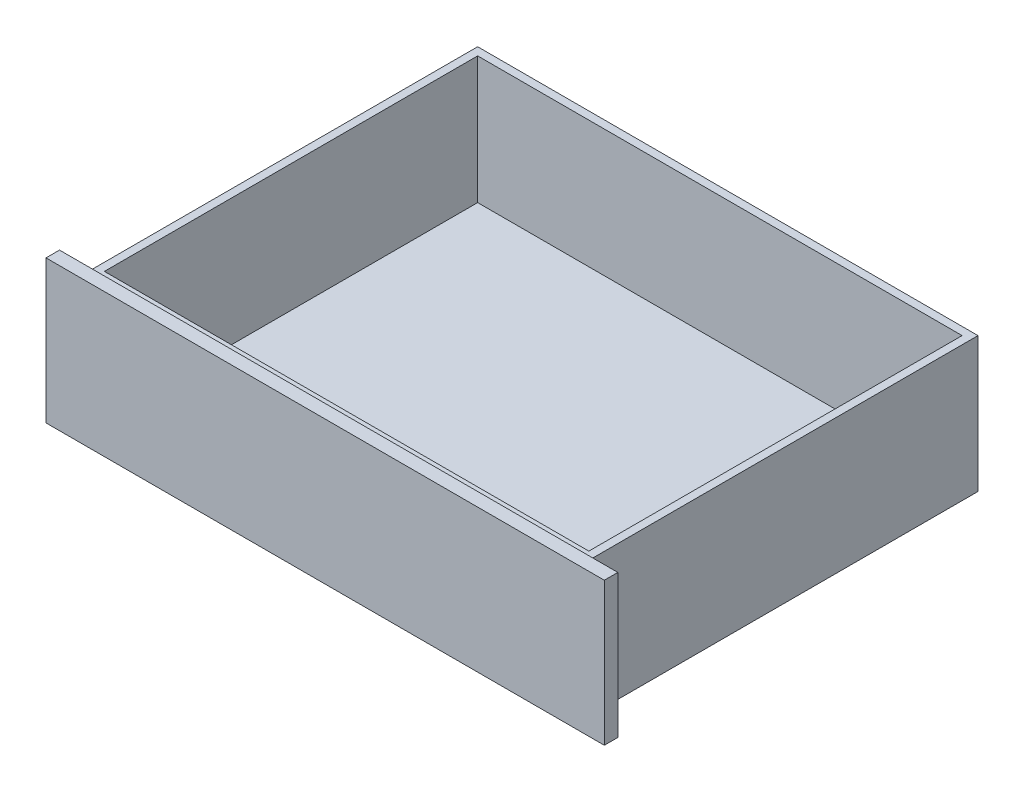
ISO-10303-21;
HEADER;
FILE_DESCRIPTION(('STEP AP214'),'2;1');
FILE_NAME('part.step','',(''),(''),'','','');
FILE_SCHEMA(('AUTOMOTIVE_DESIGN { 1 0 10303 214 1 1 1 1 }'));
ENDSEC;
DATA;
#1=APPLICATION_CONTEXT('core data for automotive mechanical design processes');
#2=APPLICATION_PROTOCOL_DEFINITION('international standard','automotive_design',2000,#1);
#3=PRODUCT_CONTEXT('',#1,'mechanical');
#4=PRODUCT('Part','Part','',(#3));
#5=PRODUCT_RELATED_PRODUCT_CATEGORY('part','',(#4));
#6=PRODUCT_DEFINITION_FORMATION('','',#4);
#7=PRODUCT_DEFINITION_CONTEXT('part definition',#1,'design');
#8=PRODUCT_DEFINITION('design','',#6,#7);
#9=PRODUCT_DEFINITION_SHAPE('','',#8);
#10=(LENGTH_UNIT() NAMED_UNIT(*) SI_UNIT(.MILLI.,.METRE.));
#11=(NAMED_UNIT(*) PLANE_ANGLE_UNIT() SI_UNIT($,.RADIAN.));
#12=(NAMED_UNIT(*) SI_UNIT($,.STERADIAN.) SOLID_ANGLE_UNIT());
#13=UNCERTAINTY_MEASURE_WITH_UNIT(LENGTH_MEASURE(1.E-05),#10,'distance_accuracy_value','');
#14=(GEOMETRIC_REPRESENTATION_CONTEXT(3) GLOBAL_UNCERTAINTY_ASSIGNED_CONTEXT((#13)) GLOBAL_UNIT_ASSIGNED_CONTEXT((#10,
#11,#12)) REPRESENTATION_CONTEXT('',''));
#15=CARTESIAN_POINT('',(0.,0.,0.));
#16=DIRECTION('',(0.,0.,1.));
#17=DIRECTION('',(1.,0.,0.));
#18=AXIS2_PLACEMENT_3D('',#15,#16,#17);
#19=CARTESIAN_POINT('',(0.,170.,0.));
#20=DIRECTION('',(0.,-1.,0.));
#21=DIRECTION('',(0.,0.,-1.));
#22=AXIS2_PLACEMENT_3D('',#19,#20,#21);
#23=PLANE('',#22);
#24=DIRECTION('',(0.,0.,-1.));
#25=VECTOR('',#24,1.);
#26=CARTESIAN_POINT('',(315.,170.,245.));
#27=LINE('',#26,#25);
#28=CARTESIAN_POINT('',(315.,170.,245.));
#29=VERTEX_POINT('',#28);
#30=CARTESIAN_POINT('',(315.,170.,-245.));
#31=VERTEX_POINT('',#30);
#32=EDGE_CURVE('E191',#29,#31,#27,.T.);
#33=ORIENTED_EDGE('',*,*,#32,.T.);
#34=DIRECTION('',(-1.,0.,0.));
#35=VECTOR('',#34,1.);
#36=CARTESIAN_POINT('',(-315.,170.,-245.));
#37=LINE('',#36,#35);
#38=CARTESIAN_POINT('',(-315.,170.,-245.));
#39=VERTEX_POINT('',#38);
#40=EDGE_CURVE('E83',#31,#39,#37,.T.);
#41=ORIENTED_EDGE('',*,*,#40,.T.);
#42=DIRECTION('',(0.,0.,1.));
#43=VECTOR('',#42,1.);
#44=CARTESIAN_POINT('',(-315.,170.,245.));
#45=LINE('',#44,#43);
#46=CARTESIAN_POINT('',(-315.,170.,245.));
#47=VERTEX_POINT('',#46);
#48=EDGE_CURVE('E195',#39,#47,#45,.T.);
#49=ORIENTED_EDGE('',*,*,#48,.T.);
#50=DIRECTION('',(1.,0.,0.));
#51=VECTOR('',#50,1.);
#52=CARTESIAN_POINT('',(-315.,170.,245.));
#53=LINE('',#52,#51);
#54=EDGE_CURVE('E58',#47,#29,#53,.T.);
#55=ORIENTED_EDGE('',*,*,#54,.T.);
#56=EDGE_LOOP('',(#33,#41,#49,#55));
#57=FACE_BOUND('',#56,.T.);
#58=DIRECTION('',(0.,0.,-1.));
#59=VECTOR('',#58,1.);
#60=CARTESIAN_POINT('',(305.,170.,0.));
#61=LINE('',#60,#59);
#62=CARTESIAN_POINT('',(305.,170.,235.));
#63=VERTEX_POINT('',#62);
#64=CARTESIAN_POINT('',(305.,170.,-235.));
#65=VERTEX_POINT('',#64);
#66=EDGE_CURVE('E184',#63,#65,#61,.T.);
#67=ORIENTED_EDGE('',*,*,#66,.F.);
#68=DIRECTION('',(1.,0.,0.));
#69=VECTOR('',#68,1.);
#70=CARTESIAN_POINT('',(0.,170.,235.));
#71=LINE('',#70,#69);
#72=CARTESIAN_POINT('',(-305.,170.,235.));
#73=VERTEX_POINT('',#72);
#74=EDGE_CURVE('E175',#73,#63,#71,.T.);
#75=ORIENTED_EDGE('',*,*,#74,.F.);
#76=DIRECTION('',(0.,0.,1.));
#77=VECTOR('',#76,1.);
#78=CARTESIAN_POINT('',(-305.,170.,0.));
#79=LINE('',#78,#77);
#80=CARTESIAN_POINT('',(-305.,170.,-235.));
#81=VERTEX_POINT('',#80);
#82=EDGE_CURVE('E188',#81,#73,#79,.T.);
#83=ORIENTED_EDGE('',*,*,#82,.F.);
#84=DIRECTION('',(-1.,0.,0.));
#85=VECTOR('',#84,1.);
#86=CARTESIAN_POINT('',(0.,170.,-235.));
#87=LINE('',#86,#85);
#88=EDGE_CURVE('E186',#65,#81,#87,.T.);
#89=ORIENTED_EDGE('',*,*,#88,.F.);
#90=EDGE_LOOP('',(#67,#75,#83,#89));
#91=FACE_BOUND('',#90,.T.);
#92=ADVANCED_FACE('F34',(#57,#91),#23,.F.);
#93=CARTESIAN_POINT('',(315.,170.,245.));
#94=DIRECTION('',(-1.,0.,0.));
#95=DIRECTION('',(0.,0.,1.));
#96=AXIS2_PLACEMENT_3D('',#93,#94,#95);
#97=PLANE('',#96);
#98=DIRECTION('',(0.,0.,-1.));
#99=VECTOR('',#98,1.);
#100=CARTESIAN_POINT('',(315.,0.,245.));
#101=LINE('',#100,#99);
#102=CARTESIAN_POINT('',(315.,0.,245.));
#103=VERTEX_POINT('',#102);
#104=CARTESIAN_POINT('',(315.,0.,-245.));
#105=VERTEX_POINT('',#104);
#106=EDGE_CURVE('E170',#103,#105,#101,.T.);
#107=ORIENTED_EDGE('',*,*,#106,.T.);
#108=DIRECTION('',(0.,-1.,0.));
#109=VECTOR('',#108,1.);
#110=CARTESIAN_POINT('',(315.,170.,-245.));
#111=LINE('',#110,#109);
#112=EDGE_CURVE('E11',#31,#105,#111,.T.);
#113=ORIENTED_EDGE('',*,*,#112,.F.);
#114=ORIENTED_EDGE('',*,*,#32,.F.);
#115=DIRECTION('',(0.,-1.,0.));
#116=VECTOR('',#115,1.);
#117=CARTESIAN_POINT('',(315.,170.,245.));
#118=LINE('',#117,#116);
#119=EDGE_CURVE('E76',#29,#103,#118,.T.);
#120=ORIENTED_EDGE('',*,*,#119,.T.);
#121=EDGE_LOOP('',(#107,#113,#114,#120));
#122=FACE_BOUND('',#121,.T.);
#123=ADVANCED_FACE('F36',(#122),#97,.F.);
#124=CARTESIAN_POINT('',(-315.,170.,-245.));
#125=DIRECTION('',(0.,0.,1.));
#126=DIRECTION('',(1.,0.,0.));
#127=AXIS2_PLACEMENT_3D('',#124,#125,#126);
#128=PLANE('',#127);
#129=DIRECTION('',(-1.,0.,0.));
#130=VECTOR('',#129,1.);
#131=CARTESIAN_POINT('',(-315.,0.,-245.));
#132=LINE('',#131,#130);
#133=CARTESIAN_POINT('',(-315.,0.,-245.));
#134=VERTEX_POINT('',#133);
#135=EDGE_CURVE('E199',#105,#134,#132,.T.);
#136=ORIENTED_EDGE('',*,*,#135,.T.);
#137=DIRECTION('',(0.,-1.,0.));
#138=VECTOR('',#137,1.);
#139=CARTESIAN_POINT('',(-315.,170.,-245.));
#140=LINE('',#139,#138);
#141=EDGE_CURVE('E42',#39,#134,#140,.T.);
#142=ORIENTED_EDGE('',*,*,#141,.F.);
#143=ORIENTED_EDGE('',*,*,#40,.F.);
#144=ORIENTED_EDGE('',*,*,#112,.T.);
#145=EDGE_LOOP('',(#136,#142,#143,#144));
#146=FACE_BOUND('',#145,.T.);
#147=ADVANCED_FACE('F238',(#146),#128,.F.);
#148=CARTESIAN_POINT('',(-315.,170.,245.));
#149=DIRECTION('',(1.,0.,0.));
#150=DIRECTION('',(0.,0.,-1.));
#151=AXIS2_PLACEMENT_3D('',#148,#149,#150);
#152=PLANE('',#151);
#153=DIRECTION('',(0.,0.,1.));
#154=VECTOR('',#153,1.);
#155=CARTESIAN_POINT('',(-315.,0.,245.));
#156=LINE('',#155,#154);
#157=CARTESIAN_POINT('',(-315.,0.,245.));
#158=VERTEX_POINT('',#157);
#159=EDGE_CURVE('E201',#134,#158,#156,.T.);
#160=ORIENTED_EDGE('',*,*,#159,.T.);
#161=DIRECTION('',(0.,-1.,0.));
#162=VECTOR('',#161,1.);
#163=CARTESIAN_POINT('',(-315.,170.,245.));
#164=LINE('',#163,#162);
#165=EDGE_CURVE('E207',#47,#158,#164,.T.);
#166=ORIENTED_EDGE('',*,*,#165,.F.);
#167=ORIENTED_EDGE('',*,*,#48,.F.);
#168=ORIENTED_EDGE('',*,*,#141,.T.);
#169=EDGE_LOOP('',(#160,#166,#167,#168));
#170=FACE_BOUND('',#169,.T.);
#171=ADVANCED_FACE('F213',(#170),#152,.F.);
#172=CARTESIAN_POINT('',(0.,0.,0.));
#173=DIRECTION('',(0.,-1.,0.));
#174=DIRECTION('',(0.,0.,-1.));
#175=AXIS2_PLACEMENT_3D('',#172,#173,#174);
#176=PLANE('',#175);
#177=ORIENTED_EDGE('',*,*,#106,.F.);
#178=DIRECTION('',(1.,0.,0.));
#179=VECTOR('',#178,1.);
#180=CARTESIAN_POINT('',(-315.,0.,245.));
#181=LINE('',#180,#179);
#182=EDGE_CURVE('E193',#158,#103,#181,.T.);
#183=ORIENTED_EDGE('',*,*,#182,.F.);
#184=ORIENTED_EDGE('',*,*,#159,.F.);
#185=ORIENTED_EDGE('',*,*,#135,.F.);
#186=EDGE_LOOP('',(#177,#183,#184,#185));
#187=FACE_BOUND('',#186,.T.);
#188=ADVANCED_FACE('F216',(#187),#176,.T.);
#189=CARTESIAN_POINT('',(305.,170.,245.));
#190=DIRECTION('',(-1.,0.,0.));
#191=DIRECTION('',(0.,0.,1.));
#192=AXIS2_PLACEMENT_3D('',#189,#190,#191);
#193=PLANE('',#192);
#194=DIRECTION('',(0.,0.,-1.));
#195=VECTOR('',#194,1.);
#196=CARTESIAN_POINT('',(305.,10.,0.));
#197=LINE('',#196,#195);
#198=CARTESIAN_POINT('',(305.,10.,235.));
#199=VERTEX_POINT('',#198);
#200=CARTESIAN_POINT('',(305.,10.,-235.));
#201=VERTEX_POINT('',#200);
#202=EDGE_CURVE('E158',#199,#201,#197,.T.);
#203=ORIENTED_EDGE('',*,*,#202,.F.);
#204=DIRECTION('',(0.,-1.,0.));
#205=VECTOR('',#204,1.);
#206=CARTESIAN_POINT('',(305.,170.,235.));
#207=LINE('',#206,#205);
#208=EDGE_CURVE('E172',#63,#199,#207,.T.);
#209=ORIENTED_EDGE('',*,*,#208,.F.);
#210=ORIENTED_EDGE('',*,*,#66,.T.);
#211=DIRECTION('',(0.,-1.,0.));
#212=VECTOR('',#211,1.);
#213=CARTESIAN_POINT('',(305.,170.,-235.));
#214=LINE('',#213,#212);
#215=EDGE_CURVE('E167',#65,#201,#214,.T.);
#216=ORIENTED_EDGE('',*,*,#215,.T.);
#217=EDGE_LOOP('',(#203,#209,#210,#216));
#218=FACE_BOUND('',#217,.T.);
#219=ADVANCED_FACE('F244',(#218),#193,.T.);
#220=CARTESIAN_POINT('',(-315.,170.,-235.));
#221=DIRECTION('',(0.,0.,1.));
#222=DIRECTION('',(1.,0.,0.));
#223=AXIS2_PLACEMENT_3D('',#220,#221,#222);
#224=PLANE('',#223);
#225=DIRECTION('',(-1.,0.,0.));
#226=VECTOR('',#225,1.);
#227=CARTESIAN_POINT('',(0.,10.,-235.));
#228=LINE('',#227,#226);
#229=CARTESIAN_POINT('',(-305.,10.,-235.));
#230=VERTEX_POINT('',#229);
#231=EDGE_CURVE('E161',#201,#230,#228,.T.);
#232=ORIENTED_EDGE('',*,*,#231,.F.);
#233=ORIENTED_EDGE('',*,*,#215,.F.);
#234=ORIENTED_EDGE('',*,*,#88,.T.);
#235=DIRECTION('',(0.,-1.,0.));
#236=VECTOR('',#235,1.);
#237=CARTESIAN_POINT('',(-305.,170.,-235.));
#238=LINE('',#237,#236);
#239=EDGE_CURVE('E171',#81,#230,#238,.T.);
#240=ORIENTED_EDGE('',*,*,#239,.T.);
#241=EDGE_LOOP('',(#232,#233,#234,#240));
#242=FACE_BOUND('',#241,.T.);
#243=ADVANCED_FACE('F266',(#242),#224,.T.);
#244=CARTESIAN_POINT('',(-305.,170.,245.));
#245=DIRECTION('',(1.,0.,0.));
#246=DIRECTION('',(0.,0.,-1.));
#247=AXIS2_PLACEMENT_3D('',#244,#245,#246);
#248=PLANE('',#247);
#249=DIRECTION('',(0.,0.,1.));
#250=VECTOR('',#249,1.);
#251=CARTESIAN_POINT('',(-305.,10.,0.));
#252=LINE('',#251,#250);
#253=CARTESIAN_POINT('',(-305.,10.,235.));
#254=VERTEX_POINT('',#253);
#255=EDGE_CURVE('E177',#230,#254,#252,.T.);
#256=ORIENTED_EDGE('',*,*,#255,.F.);
#257=ORIENTED_EDGE('',*,*,#239,.F.);
#258=ORIENTED_EDGE('',*,*,#82,.T.);
#259=DIRECTION('',(0.,-1.,0.));
#260=VECTOR('',#259,1.);
#261=CARTESIAN_POINT('',(-305.,170.,235.));
#262=LINE('',#261,#260);
#263=EDGE_CURVE('E49',#73,#254,#262,.T.);
#264=ORIENTED_EDGE('',*,*,#263,.T.);
#265=EDGE_LOOP('',(#256,#257,#258,#264));
#266=FACE_BOUND('',#265,.T.);
#267=ADVANCED_FACE('F274',(#266),#248,.T.);
#268=CARTESIAN_POINT('',(-315.,170.,235.));
#269=DIRECTION('',(0.,0.,-1.));
#270=DIRECTION('',(-1.,0.,0.));
#271=AXIS2_PLACEMENT_3D('',#268,#269,#270);
#272=PLANE('',#271);
#273=DIRECTION('',(1.,0.,0.));
#274=VECTOR('',#273,1.);
#275=CARTESIAN_POINT('',(0.,10.,235.));
#276=LINE('',#275,#274);
#277=EDGE_CURVE('E181',#254,#199,#276,.T.);
#278=ORIENTED_EDGE('',*,*,#277,.F.);
#279=ORIENTED_EDGE('',*,*,#263,.F.);
#280=ORIENTED_EDGE('',*,*,#74,.T.);
#281=ORIENTED_EDGE('',*,*,#208,.T.);
#282=EDGE_LOOP('',(#278,#279,#280,#281));
#283=FACE_BOUND('',#282,.T.);
#284=ADVANCED_FACE('F228',(#283),#272,.T.);
#285=CARTESIAN_POINT('',(0.,10.,0.));
#286=DIRECTION('',(0.,-1.,0.));
#287=DIRECTION('',(0.,0.,-1.));
#288=AXIS2_PLACEMENT_3D('',#285,#286,#287);
#289=PLANE('',#288);
#290=ORIENTED_EDGE('',*,*,#202,.T.);
#291=ORIENTED_EDGE('',*,*,#231,.T.);
#292=ORIENTED_EDGE('',*,*,#255,.T.);
#293=ORIENTED_EDGE('',*,*,#277,.T.);
#294=EDGE_LOOP('',(#290,#291,#292,#293));
#295=FACE_BOUND('',#294,.T.);
#296=ADVANCED_FACE('F220',(#295),#289,.F.);
#297=CARTESIAN_POINT('',(0.,0.,245.));
#298=DIRECTION('',(0.,0.,1.));
#299=DIRECTION('',(1.,0.,0.));
#300=AXIS2_PLACEMENT_3D('',#297,#298,#299);
#301=PLANE('',#300);
#302=DIRECTION('',(1.,0.,0.));
#303=VECTOR('',#302,1.);
#304=CARTESIAN_POINT('',(-351.5,-4.99999999999999,245.));
#305=LINE('',#304,#303);
#306=CARTESIAN_POINT('',(-351.5,-4.99999999999999,245.));
#307=VERTEX_POINT('',#306);
#308=CARTESIAN_POINT('',(351.5,-4.99999999999999,245.));
#309=VERTEX_POINT('',#308);
#310=EDGE_CURVE('E157',#307,#309,#305,.T.);
#311=ORIENTED_EDGE('',*,*,#310,.F.);
#312=DIRECTION('',(0.,1.,0.));
#313=VECTOR('',#312,1.);
#314=CARTESIAN_POINT('',(-351.5,-4.99999999999999,245.));
#315=LINE('',#314,#313);
#316=CARTESIAN_POINT('',(-351.5,175.,245.));
#317=VERTEX_POINT('',#316);
#318=EDGE_CURVE('E153',#307,#317,#315,.T.);
#319=ORIENTED_EDGE('',*,*,#318,.T.);
#320=DIRECTION('',(1.,0.,0.));
#321=VECTOR('',#320,1.);
#322=CARTESIAN_POINT('',(-351.5,175.,245.));
#323=LINE('',#322,#321);
#324=CARTESIAN_POINT('',(351.5,175.,245.));
#325=VERTEX_POINT('',#324);
#326=EDGE_CURVE('E367',#317,#325,#323,.T.);
#327=ORIENTED_EDGE('',*,*,#326,.T.);
#328=DIRECTION('',(0.,1.,0.));
#329=VECTOR('',#328,1.);
#330=CARTESIAN_POINT('',(351.5,-4.99999999999999,245.));
#331=LINE('',#330,#329);
#332=EDGE_CURVE('E369',#309,#325,#331,.T.);
#333=ORIENTED_EDGE('',*,*,#332,.F.);
#334=EDGE_LOOP('',(#311,#319,#327,#333));
#335=FACE_BOUND('',#334,.T.);
#336=ORIENTED_EDGE('',*,*,#165,.T.);
#337=ORIENTED_EDGE('',*,*,#182,.T.);
#338=ORIENTED_EDGE('',*,*,#119,.F.);
#339=ORIENTED_EDGE('',*,*,#54,.F.);
#340=EDGE_LOOP('',(#336,#337,#338,#339));
#341=FACE_BOUND('',#340,.T.);
#342=ADVANCED_FACE('F218',(#335,#341),#301,.F.);
#343=CARTESIAN_POINT('',(-351.5,-4.99999999999999,262.));
#344=DIRECTION('',(0.,1.,0.));
#345=DIRECTION('',(0.,0.,1.));
#346=AXIS2_PLACEMENT_3D('',#343,#344,#345);
#347=PLANE('',#346);
#348=ORIENTED_EDGE('',*,*,#310,.T.);
#349=DIRECTION('',(0.,0.,-1.));
#350=VECTOR('',#349,1.);
#351=CARTESIAN_POINT('',(351.5,-4.99999999999999,262.));
#352=LINE('',#351,#350);
#353=CARTESIAN_POINT('',(351.5,-4.99999999999999,262.));
#354=VERTEX_POINT('',#353);
#355=EDGE_CURVE('E138',#354,#309,#352,.T.);
#356=ORIENTED_EDGE('',*,*,#355,.F.);
#357=DIRECTION('',(1.,0.,0.));
#358=VECTOR('',#357,1.);
#359=CARTESIAN_POINT('',(-351.5,-4.99999999999999,262.));
#360=LINE('',#359,#358);
#361=CARTESIAN_POINT('',(-351.5,-4.99999999999999,262.));
#362=VERTEX_POINT('',#361);
#363=EDGE_CURVE('E145',#362,#354,#360,.T.);
#364=ORIENTED_EDGE('',*,*,#363,.F.);
#365=DIRECTION('',(0.,0.,-1.));
#366=VECTOR('',#365,1.);
#367=CARTESIAN_POINT('',(-351.5,-4.99999999999999,262.));
#368=LINE('',#367,#366);
#369=EDGE_CURVE('E364',#362,#307,#368,.T.);
#370=ORIENTED_EDGE('',*,*,#369,.T.);
#371=EDGE_LOOP('',(#348,#356,#364,#370));
#372=FACE_BOUND('',#371,.T.);
#373=ADVANCED_FACE('F155',(#372),#347,.F.);
#374=CARTESIAN_POINT('',(351.5,-4.99999999999999,262.));
#375=DIRECTION('',(-1.,0.,0.));
#376=DIRECTION('',(0.,0.,1.));
#377=AXIS2_PLACEMENT_3D('',#374,#375,#376);
#378=PLANE('',#377);
#379=ORIENTED_EDGE('',*,*,#332,.T.);
#380=DIRECTION('',(0.,0.,-1.));
#381=VECTOR('',#380,1.);
#382=CARTESIAN_POINT('',(351.5,175.,262.));
#383=LINE('',#382,#381);
#384=CARTESIAN_POINT('',(351.5,175.,262.));
#385=VERTEX_POINT('',#384);
#386=EDGE_CURVE('E140',#385,#325,#383,.T.);
#387=ORIENTED_EDGE('',*,*,#386,.F.);
#388=DIRECTION('',(0.,1.,0.));
#389=VECTOR('',#388,1.);
#390=CARTESIAN_POINT('',(351.5,-4.99999999999999,262.));
#391=LINE('',#390,#389);
#392=EDGE_CURVE('E133',#354,#385,#391,.T.);
#393=ORIENTED_EDGE('',*,*,#392,.F.);
#394=ORIENTED_EDGE('',*,*,#355,.T.);
#395=EDGE_LOOP('',(#379,#387,#393,#394));
#396=FACE_BOUND('',#395,.T.);
#397=ADVANCED_FACE('F136',(#396),#378,.F.);
#398=CARTESIAN_POINT('',(-351.5,175.,262.));
#399=DIRECTION('',(0.,1.,0.));
#400=DIRECTION('',(0.,0.,1.));
#401=AXIS2_PLACEMENT_3D('',#398,#399,#400);
#402=PLANE('',#401);
#403=ORIENTED_EDGE('',*,*,#326,.F.);
#404=DIRECTION('',(0.,0.,-1.));
#405=VECTOR('',#404,1.);
#406=CARTESIAN_POINT('',(-351.5,175.,262.));
#407=LINE('',#406,#405);
#408=CARTESIAN_POINT('',(-351.5,175.,262.));
#409=VERTEX_POINT('',#408);
#410=EDGE_CURVE('E163',#409,#317,#407,.T.);
#411=ORIENTED_EDGE('',*,*,#410,.F.);
#412=DIRECTION('',(1.,0.,0.));
#413=VECTOR('',#412,1.);
#414=CARTESIAN_POINT('',(-351.5,175.,262.));
#415=LINE('',#414,#413);
#416=EDGE_CURVE('E144',#409,#385,#415,.T.);
#417=ORIENTED_EDGE('',*,*,#416,.T.);
#418=ORIENTED_EDGE('',*,*,#386,.T.);
#419=EDGE_LOOP('',(#403,#411,#417,#418));
#420=FACE_BOUND('',#419,.T.);
#421=ADVANCED_FACE('F333',(#420),#402,.T.);
#422=CARTESIAN_POINT('',(-351.5,-4.99999999999999,262.));
#423=DIRECTION('',(-1.,0.,0.));
#424=DIRECTION('',(0.,0.,1.));
#425=AXIS2_PLACEMENT_3D('',#422,#423,#424);
#426=PLANE('',#425);
#427=ORIENTED_EDGE('',*,*,#318,.F.);
#428=ORIENTED_EDGE('',*,*,#369,.F.);
#429=DIRECTION('',(0.,1.,0.));
#430=VECTOR('',#429,1.);
#431=CARTESIAN_POINT('',(-351.5,-4.99999999999999,262.));
#432=LINE('',#431,#430);
#433=EDGE_CURVE('E151',#362,#409,#432,.T.);
#434=ORIENTED_EDGE('',*,*,#433,.T.);
#435=ORIENTED_EDGE('',*,*,#410,.T.);
#436=EDGE_LOOP('',(#427,#428,#434,#435));
#437=FACE_BOUND('',#436,.T.);
#438=ADVANCED_FACE('F341',(#437),#426,.T.);
#439=CARTESIAN_POINT('',(0.,0.,262.));
#440=DIRECTION('',(0.,0.,1.));
#441=DIRECTION('',(1.,0.,0.));
#442=AXIS2_PLACEMENT_3D('',#439,#440,#441);
#443=PLANE('',#442);
#444=ORIENTED_EDGE('',*,*,#363,.T.);
#445=ORIENTED_EDGE('',*,*,#392,.T.);
#446=ORIENTED_EDGE('',*,*,#416,.F.);
#447=ORIENTED_EDGE('',*,*,#433,.F.);
#448=EDGE_LOOP('',(#444,#445,#446,#447));
#449=FACE_BOUND('',#448,.T.);
#450=ADVANCED_FACE('F149',(#449),#443,.T.);
#451=CLOSED_SHELL('',(#92,#123,#147,#171,#188,#219,#243,#267,#284,#296,#342,#373,#397,#421,#438,#450));
#452=MANIFOLD_SOLID_BREP('B2',#451);
#453=ADVANCED_BREP_SHAPE_REPRESENTATION('',(#18,#452),#14);
#454=SHAPE_DEFINITION_REPRESENTATION(#9,#453);
ENDSEC;
END-ISO-10303-21;
